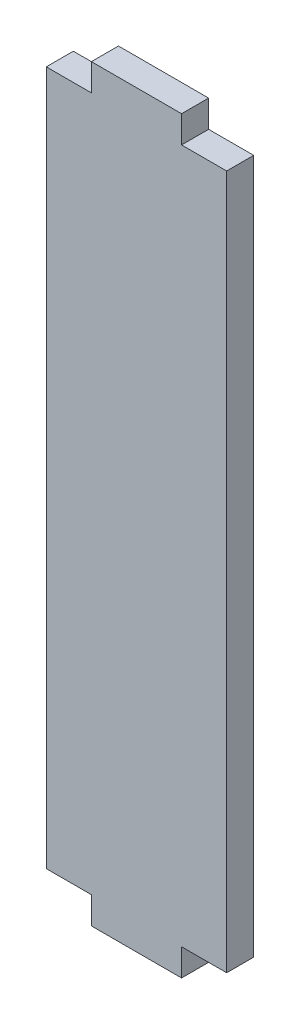
ISO-10303-21;
HEADER;
FILE_DESCRIPTION(('STEP AP214'),'2;1');
FILE_NAME('part.step','',(''),(''),'','','');
FILE_SCHEMA(('AUTOMOTIVE_DESIGN { 1 0 10303 214 1 1 1 1 }'));
ENDSEC;
DATA;
#1=APPLICATION_CONTEXT('core data for automotive mechanical design processes');
#2=APPLICATION_PROTOCOL_DEFINITION('international standard','automotive_design',2000,#1);
#3=PRODUCT_CONTEXT('',#1,'mechanical');
#4=PRODUCT('Part','Part','',(#3));
#5=PRODUCT_RELATED_PRODUCT_CATEGORY('part','',(#4));
#6=PRODUCT_DEFINITION_FORMATION('','',#4);
#7=PRODUCT_DEFINITION_CONTEXT('part definition',#1,'design');
#8=PRODUCT_DEFINITION('design','',#6,#7);
#9=PRODUCT_DEFINITION_SHAPE('','',#8);
#10=(LENGTH_UNIT() NAMED_UNIT(*) SI_UNIT(.MILLI.,.METRE.));
#11=(NAMED_UNIT(*) PLANE_ANGLE_UNIT() SI_UNIT($,.RADIAN.));
#12=(NAMED_UNIT(*) SI_UNIT($,.STERADIAN.) SOLID_ANGLE_UNIT());
#13=UNCERTAINTY_MEASURE_WITH_UNIT(LENGTH_MEASURE(1.E-05),#10,'distance_accuracy_value','');
#14=(GEOMETRIC_REPRESENTATION_CONTEXT(3) GLOBAL_UNCERTAINTY_ASSIGNED_CONTEXT((#13)) GLOBAL_UNIT_ASSIGNED_CONTEXT((#10,
#11,#12)) REPRESENTATION_CONTEXT('',''));
#15=CARTESIAN_POINT('',(0.,0.,0.));
#16=DIRECTION('',(0.,0.,1.));
#17=DIRECTION('',(1.,0.,0.));
#18=AXIS2_PLACEMENT_3D('',#15,#16,#17);
#19=CARTESIAN_POINT('',(4.99999999999999,-38.5,3.));
#20=DIRECTION('',(0.,1.,0.));
#21=DIRECTION('',(0.,0.,1.));
#22=AXIS2_PLACEMENT_3D('',#19,#20,#21);
#23=PLANE('',#22);
#24=DIRECTION('',(1.,0.,0.));
#25=VECTOR('',#24,1.);
#26=CARTESIAN_POINT('',(4.99999999999999,-38.5,0.));
#27=LINE('',#26,#25);
#28=CARTESIAN_POINT('',(4.99999999999999,-38.5,0.));
#29=VERTEX_POINT('',#28);
#30=CARTESIAN_POINT('',(10.,-38.5,0.));
#31=VERTEX_POINT('',#30);
#32=EDGE_CURVE('E164',#29,#31,#27,.T.);
#33=ORIENTED_EDGE('',*,*,#32,.T.);
#34=DIRECTION('',(0.,0.,-1.));
#35=VECTOR('',#34,1.);
#36=CARTESIAN_POINT('',(10.,-38.5,3.));
#37=LINE('',#36,#35);
#38=CARTESIAN_POINT('',(10.,-38.5,3.));
#39=VERTEX_POINT('',#38);
#40=EDGE_CURVE('E11',#39,#31,#37,.T.);
#41=ORIENTED_EDGE('',*,*,#40,.F.);
#42=DIRECTION('',(1.,0.,0.));
#43=VECTOR('',#42,1.);
#44=CARTESIAN_POINT('',(4.99999999999999,-38.5,3.));
#45=LINE('',#44,#43);
#46=CARTESIAN_POINT('',(4.99999999999999,-38.5,3.));
#47=VERTEX_POINT('',#46);
#48=EDGE_CURVE('E198',#47,#39,#45,.T.);
#49=ORIENTED_EDGE('',*,*,#48,.F.);
#50=DIRECTION('',(0.,0.,-1.));
#51=VECTOR('',#50,1.);
#52=CARTESIAN_POINT('',(4.99999999999999,-38.5,3.));
#53=LINE('',#52,#51);
#54=EDGE_CURVE('E160',#47,#29,#53,.T.);
#55=ORIENTED_EDGE('',*,*,#54,.T.);
#56=EDGE_LOOP('',(#33,#41,#49,#55));
#57=FACE_BOUND('',#56,.T.);
#58=ADVANCED_FACE('F39',(#57),#23,.F.);
#59=CARTESIAN_POINT('',(9.99999999999999,38.5,3.));
#60=DIRECTION('',(-1.,0.,0.));
#61=DIRECTION('',(0.,-1.,0.));
#62=AXIS2_PLACEMENT_3D('',#59,#60,#61);
#63=PLANE('',#62);
#64=DIRECTION('',(0.,1.,0.));
#65=VECTOR('',#64,1.);
#66=CARTESIAN_POINT('',(9.99999999999999,38.5,0.));
#67=LINE('',#66,#65);
#68=CARTESIAN_POINT('',(9.99999999999999,38.5,0.));
#69=VERTEX_POINT('',#68);
#70=EDGE_CURVE('E168',#31,#69,#67,.T.);
#71=ORIENTED_EDGE('',*,*,#70,.T.);
#72=DIRECTION('',(0.,0.,-1.));
#73=VECTOR('',#72,1.);
#74=CARTESIAN_POINT('',(9.99999999999999,38.5,3.));
#75=LINE('',#74,#73);
#76=CARTESIAN_POINT('',(9.99999999999999,38.5,3.));
#77=VERTEX_POINT('',#76);
#78=EDGE_CURVE('E48',#77,#69,#75,.T.);
#79=ORIENTED_EDGE('',*,*,#78,.F.);
#80=DIRECTION('',(0.,1.,0.));
#81=VECTOR('',#80,1.);
#82=CARTESIAN_POINT('',(9.99999999999999,38.5,3.));
#83=LINE('',#82,#81);
#84=EDGE_CURVE('E111',#39,#77,#83,.T.);
#85=ORIENTED_EDGE('',*,*,#84,.F.);
#86=ORIENTED_EDGE('',*,*,#40,.T.);
#87=EDGE_LOOP('',(#71,#79,#85,#86));
#88=FACE_BOUND('',#87,.T.);
#89=ADVANCED_FACE('F292',(#88),#63,.F.);
#90=CARTESIAN_POINT('',(4.99999999999999,38.5,3.));
#91=DIRECTION('',(0.,-1.,0.));
#92=DIRECTION('',(0.,0.,-1.));
#93=AXIS2_PLACEMENT_3D('',#90,#91,#92);
#94=PLANE('',#93);
#95=DIRECTION('',(-1.,0.,0.));
#96=VECTOR('',#95,1.);
#97=CARTESIAN_POINT('',(4.99999999999999,38.5,0.));
#98=LINE('',#97,#96);
#99=CARTESIAN_POINT('',(4.99999999999999,38.5,0.));
#100=VERTEX_POINT('',#99);
#101=EDGE_CURVE('E171',#69,#100,#98,.T.);
#102=ORIENTED_EDGE('',*,*,#101,.T.);
#103=DIRECTION('',(0.,0.,-1.));
#104=VECTOR('',#103,1.);
#105=CARTESIAN_POINT('',(4.99999999999999,38.5,3.));
#106=LINE('',#105,#104);
#107=CARTESIAN_POINT('',(4.99999999999999,38.5,3.));
#108=VERTEX_POINT('',#107);
#109=EDGE_CURVE('E225',#108,#100,#106,.T.);
#110=ORIENTED_EDGE('',*,*,#109,.F.);
#111=DIRECTION('',(-1.,0.,0.));
#112=VECTOR('',#111,1.);
#113=CARTESIAN_POINT('',(4.99999999999999,38.5,3.));
#114=LINE('',#113,#112);
#115=EDGE_CURVE('E235',#77,#108,#114,.T.);
#116=ORIENTED_EDGE('',*,*,#115,.F.);
#117=ORIENTED_EDGE('',*,*,#78,.T.);
#118=EDGE_LOOP('',(#102,#110,#116,#117));
#119=FACE_BOUND('',#118,.T.);
#120=ADVANCED_FACE('F233',(#119),#94,.F.);
#121=CARTESIAN_POINT('',(4.99999999999999,38.5,3.));
#122=DIRECTION('',(-1.,0.,0.));
#123=DIRECTION('',(0.,0.,1.));
#124=AXIS2_PLACEMENT_3D('',#121,#122,#123);
#125=PLANE('',#124);
#126=DIRECTION('',(0.,1.,0.));
#127=VECTOR('',#126,1.);
#128=CARTESIAN_POINT('',(4.99999999999999,38.5,0.));
#129=LINE('',#128,#127);
#130=CARTESIAN_POINT('',(4.99999999999999,41.5,0.));
#131=VERTEX_POINT('',#130);
#132=EDGE_CURVE('E174',#100,#131,#129,.T.);
#133=ORIENTED_EDGE('',*,*,#132,.T.);
#134=DIRECTION('',(0.,0.,-1.));
#135=VECTOR('',#134,1.);
#136=CARTESIAN_POINT('',(4.99999999999999,41.5,3.));
#137=LINE('',#136,#135);
#138=CARTESIAN_POINT('',(4.99999999999999,41.5,3.));
#139=VERTEX_POINT('',#138);
#140=EDGE_CURVE('E221',#139,#131,#137,.T.);
#141=ORIENTED_EDGE('',*,*,#140,.F.);
#142=DIRECTION('',(0.,1.,0.));
#143=VECTOR('',#142,1.);
#144=CARTESIAN_POINT('',(4.99999999999999,38.5,3.));
#145=LINE('',#144,#143);
#146=EDGE_CURVE('E254',#108,#139,#145,.T.);
#147=ORIENTED_EDGE('',*,*,#146,.F.);
#148=ORIENTED_EDGE('',*,*,#109,.T.);
#149=EDGE_LOOP('',(#133,#141,#147,#148));
#150=FACE_BOUND('',#149,.T.);
#151=ADVANCED_FACE('F244',(#150),#125,.F.);
#152=CARTESIAN_POINT('',(4.99999999999999,41.5,3.));
#153=DIRECTION('',(0.,-1.,0.));
#154=DIRECTION('',(0.,0.,-1.));
#155=AXIS2_PLACEMENT_3D('',#152,#153,#154);
#156=PLANE('',#155);
#157=DIRECTION('',(-1.,0.,0.));
#158=VECTOR('',#157,1.);
#159=CARTESIAN_POINT('',(4.99999999999999,41.5,0.));
#160=LINE('',#159,#158);
#161=CARTESIAN_POINT('',(-5.00000000000001,41.5,0.));
#162=VERTEX_POINT('',#161);
#163=EDGE_CURVE('E177',#131,#162,#160,.T.);
#164=ORIENTED_EDGE('',*,*,#163,.T.);
#165=DIRECTION('',(0.,0.,-1.));
#166=VECTOR('',#165,1.);
#167=CARTESIAN_POINT('',(-5.00000000000001,41.5,3.));
#168=LINE('',#167,#166);
#169=CARTESIAN_POINT('',(-5.00000000000001,41.5,3.));
#170=VERTEX_POINT('',#169);
#171=EDGE_CURVE('E217',#170,#162,#168,.T.);
#172=ORIENTED_EDGE('',*,*,#171,.F.);
#173=DIRECTION('',(-1.,0.,0.));
#174=VECTOR('',#173,1.);
#175=CARTESIAN_POINT('',(4.99999999999999,41.5,3.));
#176=LINE('',#175,#174);
#177=EDGE_CURVE('E250',#139,#170,#176,.T.);
#178=ORIENTED_EDGE('',*,*,#177,.F.);
#179=ORIENTED_EDGE('',*,*,#140,.T.);
#180=EDGE_LOOP('',(#164,#172,#178,#179));
#181=FACE_BOUND('',#180,.T.);
#182=ADVANCED_FACE('F248',(#181),#156,.F.);
#183=CARTESIAN_POINT('',(-5.00000000000001,41.5,3.));
#184=DIRECTION('',(1.,0.,0.));
#185=DIRECTION('',(0.,1.,0.));
#186=AXIS2_PLACEMENT_3D('',#183,#184,#185);
#187=PLANE('',#186);
#188=DIRECTION('',(0.,-1.,0.));
#189=VECTOR('',#188,1.);
#190=CARTESIAN_POINT('',(-5.00000000000001,41.5,0.));
#191=LINE('',#190,#189);
#192=CARTESIAN_POINT('',(-5.00000000000001,38.5,0.));
#193=VERTEX_POINT('',#192);
#194=EDGE_CURVE('E180',#162,#193,#191,.T.);
#195=ORIENTED_EDGE('',*,*,#194,.T.);
#196=DIRECTION('',(0.,0.,-1.));
#197=VECTOR('',#196,1.);
#198=CARTESIAN_POINT('',(-5.00000000000001,38.5,3.));
#199=LINE('',#198,#197);
#200=CARTESIAN_POINT('',(-5.00000000000001,38.5,3.));
#201=VERTEX_POINT('',#200);
#202=EDGE_CURVE('E213',#201,#193,#199,.T.);
#203=ORIENTED_EDGE('',*,*,#202,.F.);
#204=DIRECTION('',(0.,-1.,0.));
#205=VECTOR('',#204,1.);
#206=CARTESIAN_POINT('',(-5.00000000000001,41.5,3.));
#207=LINE('',#206,#205);
#208=EDGE_CURVE('E253',#170,#201,#207,.T.);
#209=ORIENTED_EDGE('',*,*,#208,.F.);
#210=ORIENTED_EDGE('',*,*,#171,.T.);
#211=EDGE_LOOP('',(#195,#203,#209,#210));
#212=FACE_BOUND('',#211,.T.);
#213=ADVANCED_FACE('F305',(#212),#187,.F.);
#214=CARTESIAN_POINT('',(-10.,38.5,3.));
#215=DIRECTION('',(0.,-1.,0.));
#216=DIRECTION('',(0.,0.,-1.));
#217=AXIS2_PLACEMENT_3D('',#214,#215,#216);
#218=PLANE('',#217);
#219=DIRECTION('',(-1.,0.,0.));
#220=VECTOR('',#219,1.);
#221=CARTESIAN_POINT('',(-10.,38.5,0.));
#222=LINE('',#221,#220);
#223=CARTESIAN_POINT('',(-10.,38.5,0.));
#224=VERTEX_POINT('',#223);
#225=EDGE_CURVE('E183',#193,#224,#222,.T.);
#226=ORIENTED_EDGE('',*,*,#225,.T.);
#227=DIRECTION('',(0.,0.,-1.));
#228=VECTOR('',#227,1.);
#229=CARTESIAN_POINT('',(-10.,38.5,3.));
#230=LINE('',#229,#228);
#231=CARTESIAN_POINT('',(-10.,38.5,3.));
#232=VERTEX_POINT('',#231);
#233=EDGE_CURVE('E209',#232,#224,#230,.T.);
#234=ORIENTED_EDGE('',*,*,#233,.F.);
#235=DIRECTION('',(-1.,0.,0.));
#236=VECTOR('',#235,1.);
#237=CARTESIAN_POINT('',(-10.,38.5,3.));
#238=LINE('',#237,#236);
#239=EDGE_CURVE('E258',#201,#232,#238,.T.);
#240=ORIENTED_EDGE('',*,*,#239,.F.);
#241=ORIENTED_EDGE('',*,*,#202,.T.);
#242=EDGE_LOOP('',(#226,#234,#240,#241));
#243=FACE_BOUND('',#242,.T.);
#244=ADVANCED_FACE('F308',(#243),#218,.F.);
#245=CARTESIAN_POINT('',(-10.,38.5,3.));
#246=DIRECTION('',(1.,0.,0.));
#247=DIRECTION('',(0.,1.,0.));
#248=AXIS2_PLACEMENT_3D('',#245,#246,#247);
#249=PLANE('',#248);
#250=DIRECTION('',(0.,-1.,0.));
#251=VECTOR('',#250,1.);
#252=CARTESIAN_POINT('',(-10.,38.5,0.));
#253=LINE('',#252,#251);
#254=CARTESIAN_POINT('',(-10.,-38.5,0.));
#255=VERTEX_POINT('',#254);
#256=EDGE_CURVE('E186',#224,#255,#253,.T.);
#257=ORIENTED_EDGE('',*,*,#256,.T.);
#258=DIRECTION('',(0.,0.,-1.));
#259=VECTOR('',#258,1.);
#260=CARTESIAN_POINT('',(-10.,-38.5,3.));
#261=LINE('',#260,#259);
#262=CARTESIAN_POINT('',(-10.,-38.5,3.));
#263=VERTEX_POINT('',#262);
#264=EDGE_CURVE('E205',#263,#255,#261,.T.);
#265=ORIENTED_EDGE('',*,*,#264,.F.);
#266=DIRECTION('',(0.,-1.,0.));
#267=VECTOR('',#266,1.);
#268=CARTESIAN_POINT('',(-10.,38.5,3.));
#269=LINE('',#268,#267);
#270=EDGE_CURVE('E265',#232,#263,#269,.T.);
#271=ORIENTED_EDGE('',*,*,#270,.F.);
#272=ORIENTED_EDGE('',*,*,#233,.T.);
#273=EDGE_LOOP('',(#257,#265,#271,#272));
#274=FACE_BOUND('',#273,.T.);
#275=ADVANCED_FACE('F273',(#274),#249,.F.);
#276=CARTESIAN_POINT('',(-10.,-38.5,3.));
#277=DIRECTION('',(0.,1.,0.));
#278=DIRECTION('',(0.,0.,1.));
#279=AXIS2_PLACEMENT_3D('',#276,#277,#278);
#280=PLANE('',#279);
#281=DIRECTION('',(1.,0.,0.));
#282=VECTOR('',#281,1.);
#283=CARTESIAN_POINT('',(-10.,-38.5,0.));
#284=LINE('',#283,#282);
#285=CARTESIAN_POINT('',(-5.00000000000001,-38.5,0.));
#286=VERTEX_POINT('',#285);
#287=EDGE_CURVE('E189',#255,#286,#284,.T.);
#288=ORIENTED_EDGE('',*,*,#287,.T.);
#289=DIRECTION('',(0.,0.,-1.));
#290=VECTOR('',#289,1.);
#291=CARTESIAN_POINT('',(-5.00000000000001,-38.5,3.));
#292=LINE('',#291,#290);
#293=CARTESIAN_POINT('',(-5.00000000000001,-38.5,3.));
#294=VERTEX_POINT('',#293);
#295=EDGE_CURVE('E153',#294,#286,#292,.T.);
#296=ORIENTED_EDGE('',*,*,#295,.F.);
#297=DIRECTION('',(1.,0.,0.));
#298=VECTOR('',#297,1.);
#299=CARTESIAN_POINT('',(-10.,-38.5,3.));
#300=LINE('',#299,#298);
#301=EDGE_CURVE('E142',#263,#294,#300,.T.);
#302=ORIENTED_EDGE('',*,*,#301,.F.);
#303=ORIENTED_EDGE('',*,*,#264,.T.);
#304=EDGE_LOOP('',(#288,#296,#302,#303));
#305=FACE_BOUND('',#304,.T.);
#306=ADVANCED_FACE('F277',(#305),#280,.F.);
#307=CARTESIAN_POINT('',(-5.00000000000001,-38.5,3.));
#308=DIRECTION('',(1.,0.,0.));
#309=DIRECTION('',(0.,1.,0.));
#310=AXIS2_PLACEMENT_3D('',#307,#308,#309);
#311=PLANE('',#310);
#312=DIRECTION('',(0.,-1.,0.));
#313=VECTOR('',#312,1.);
#314=CARTESIAN_POINT('',(-5.00000000000001,-38.5,0.));
#315=LINE('',#314,#313);
#316=CARTESIAN_POINT('',(-5.,-41.5,0.));
#317=VERTEX_POINT('',#316);
#318=EDGE_CURVE('E151',#286,#317,#315,.T.);
#319=ORIENTED_EDGE('',*,*,#318,.T.);
#320=DIRECTION('',(0.,0.,-1.));
#321=VECTOR('',#320,1.);
#322=CARTESIAN_POINT('',(-5.,-41.5,3.));
#323=LINE('',#322,#321);
#324=CARTESIAN_POINT('',(-5.,-41.5,3.));
#325=VERTEX_POINT('',#324);
#326=EDGE_CURVE('E148',#325,#317,#323,.T.);
#327=ORIENTED_EDGE('',*,*,#326,.F.);
#328=DIRECTION('',(0.,-1.,0.));
#329=VECTOR('',#328,1.);
#330=CARTESIAN_POINT('',(-5.00000000000001,-38.5,3.));
#331=LINE('',#330,#329);
#332=EDGE_CURVE('E136',#294,#325,#331,.T.);
#333=ORIENTED_EDGE('',*,*,#332,.F.);
#334=ORIENTED_EDGE('',*,*,#295,.T.);
#335=EDGE_LOOP('',(#319,#327,#333,#334));
#336=FACE_BOUND('',#335,.T.);
#337=ADVANCED_FACE('F149',(#336),#311,.F.);
#338=CARTESIAN_POINT('',(-5.,-41.5,3.));
#339=DIRECTION('',(0.,1.,0.));
#340=DIRECTION('',(0.,0.,1.));
#341=AXIS2_PLACEMENT_3D('',#338,#339,#340);
#342=PLANE('',#341);
#343=DIRECTION('',(1.,0.,0.));
#344=VECTOR('',#343,1.);
#345=CARTESIAN_POINT('',(-5.,-41.5,0.));
#346=LINE('',#345,#344);
#347=CARTESIAN_POINT('',(5.00000000000001,-41.5,0.));
#348=VERTEX_POINT('',#347);
#349=EDGE_CURVE('E97',#317,#348,#346,.T.);
#350=ORIENTED_EDGE('',*,*,#349,.T.);
#351=DIRECTION('',(0.,0.,-1.));
#352=VECTOR('',#351,1.);
#353=CARTESIAN_POINT('',(5.00000000000001,-41.5,3.));
#354=LINE('',#353,#352);
#355=CARTESIAN_POINT('',(5.00000000000001,-41.5,3.));
#356=VERTEX_POINT('',#355);
#357=EDGE_CURVE('E154',#356,#348,#354,.T.);
#358=ORIENTED_EDGE('',*,*,#357,.F.);
#359=DIRECTION('',(1.,0.,0.));
#360=VECTOR('',#359,1.);
#361=CARTESIAN_POINT('',(-5.,-41.5,3.));
#362=LINE('',#361,#360);
#363=EDGE_CURVE('E140',#325,#356,#362,.T.);
#364=ORIENTED_EDGE('',*,*,#363,.F.);
#365=ORIENTED_EDGE('',*,*,#326,.T.);
#366=EDGE_LOOP('',(#350,#358,#364,#365));
#367=FACE_BOUND('',#366,.T.);
#368=ADVANCED_FACE('F156',(#367),#342,.F.);
#369=CARTESIAN_POINT('',(5.00000000000001,-41.5,3.));
#370=DIRECTION('',(-1.,0.,0.));
#371=DIRECTION('',(0.,-1.,0.));
#372=AXIS2_PLACEMENT_3D('',#369,#370,#371);
#373=PLANE('',#372);
#374=DIRECTION('',(0.,1.,0.));
#375=VECTOR('',#374,1.);
#376=CARTESIAN_POINT('',(5.00000000000001,-41.5,0.));
#377=LINE('',#376,#375);
#378=EDGE_CURVE('E103',#348,#29,#377,.T.);
#379=ORIENTED_EDGE('',*,*,#378,.T.);
#380=ORIENTED_EDGE('',*,*,#54,.F.);
#381=DIRECTION('',(0.,1.,0.));
#382=VECTOR('',#381,1.);
#383=CARTESIAN_POINT('',(5.00000000000001,-41.5,3.));
#384=LINE('',#383,#382);
#385=EDGE_CURVE('E56',#356,#47,#384,.T.);
#386=ORIENTED_EDGE('',*,*,#385,.F.);
#387=ORIENTED_EDGE('',*,*,#357,.T.);
#388=EDGE_LOOP('',(#379,#380,#386,#387));
#389=FACE_BOUND('',#388,.T.);
#390=ADVANCED_FACE('F281',(#389),#373,.F.);
#391=CARTESIAN_POINT('',(0.,0.,3.));
#392=DIRECTION('',(0.,0.,-1.));
#393=DIRECTION('',(-1.,0.,0.));
#394=AXIS2_PLACEMENT_3D('',#391,#392,#393);
#395=PLANE('',#394);
#396=ORIENTED_EDGE('',*,*,#48,.T.);
#397=ORIENTED_EDGE('',*,*,#84,.T.);
#398=ORIENTED_EDGE('',*,*,#115,.T.);
#399=ORIENTED_EDGE('',*,*,#146,.T.);
#400=ORIENTED_EDGE('',*,*,#177,.T.);
#401=ORIENTED_EDGE('',*,*,#208,.T.);
#402=ORIENTED_EDGE('',*,*,#239,.T.);
#403=ORIENTED_EDGE('',*,*,#270,.T.);
#404=ORIENTED_EDGE('',*,*,#301,.T.);
#405=ORIENTED_EDGE('',*,*,#332,.T.);
#406=ORIENTED_EDGE('',*,*,#363,.T.);
#407=ORIENTED_EDGE('',*,*,#385,.T.);
#408=EDGE_LOOP('',(#396,#397,#398,#399,#400,#401,#402,#403,#404,#405,#406,#407));
#409=FACE_BOUND('',#408,.T.);
#410=ADVANCED_FACE('F138',(#409),#395,.F.);
#411=CARTESIAN_POINT('',(0.,0.,0.));
#412=DIRECTION('',(0.,0.,-1.));
#413=DIRECTION('',(-1.,0.,0.));
#414=AXIS2_PLACEMENT_3D('',#411,#412,#413);
#415=PLANE('',#414);
#416=ORIENTED_EDGE('',*,*,#32,.F.);
#417=ORIENTED_EDGE('',*,*,#378,.F.);
#418=ORIENTED_EDGE('',*,*,#349,.F.);
#419=ORIENTED_EDGE('',*,*,#318,.F.);
#420=ORIENTED_EDGE('',*,*,#287,.F.);
#421=ORIENTED_EDGE('',*,*,#256,.F.);
#422=ORIENTED_EDGE('',*,*,#225,.F.);
#423=ORIENTED_EDGE('',*,*,#194,.F.);
#424=ORIENTED_EDGE('',*,*,#163,.F.);
#425=ORIENTED_EDGE('',*,*,#132,.F.);
#426=ORIENTED_EDGE('',*,*,#101,.F.);
#427=ORIENTED_EDGE('',*,*,#70,.F.);
#428=EDGE_LOOP('',(#416,#417,#418,#419,#420,#421,#422,#423,#424,#425,#426,#427));
#429=FACE_BOUND('',#428,.T.);
#430=ADVANCED_FACE('F239',(#429),#415,.T.);
#431=CLOSED_SHELL('',(#58,#89,#120,#151,#182,#213,#244,#275,#306,#337,#368,#390,#410,#430));
#432=MANIFOLD_SOLID_BREP('B2',#431);
#433=ADVANCED_BREP_SHAPE_REPRESENTATION('',(#18,#432),#14);
#434=SHAPE_DEFINITION_REPRESENTATION(#9,#433);
ENDSEC;
END-ISO-10303-21;
